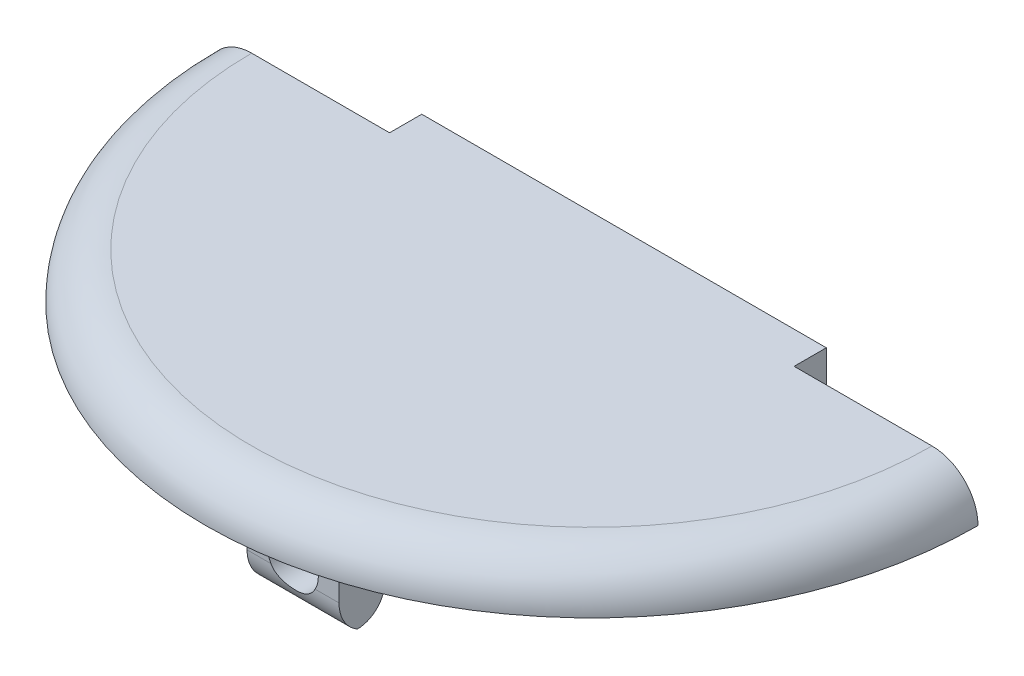
ISO-10303-21;
HEADER;
FILE_DESCRIPTION(('STEP AP214'),'2;1');
FILE_NAME('part.step','',(''),(''),'','','');
FILE_SCHEMA(('AUTOMOTIVE_DESIGN { 1 0 10303 214 1 1 1 1 }'));
ENDSEC;
DATA;
#1=APPLICATION_CONTEXT('core data for automotive mechanical design processes');
#2=APPLICATION_PROTOCOL_DEFINITION('international standard','automotive_design',2000,#1);
#3=PRODUCT_CONTEXT('',#1,'mechanical');
#4=PRODUCT('Part','Part','',(#3));
#5=PRODUCT_RELATED_PRODUCT_CATEGORY('part','',(#4));
#6=PRODUCT_DEFINITION_FORMATION('','',#4);
#7=PRODUCT_DEFINITION_CONTEXT('part definition',#1,'design');
#8=PRODUCT_DEFINITION('design','',#6,#7);
#9=PRODUCT_DEFINITION_SHAPE('','',#8);
#10=(LENGTH_UNIT() NAMED_UNIT(*) SI_UNIT(.MILLI.,.METRE.));
#11=(NAMED_UNIT(*) PLANE_ANGLE_UNIT() SI_UNIT($,.RADIAN.));
#12=(NAMED_UNIT(*) SI_UNIT($,.STERADIAN.) SOLID_ANGLE_UNIT());
#13=UNCERTAINTY_MEASURE_WITH_UNIT(LENGTH_MEASURE(1.E-05),#10,'distance_accuracy_value','');
#14=(GEOMETRIC_REPRESENTATION_CONTEXT(3) GLOBAL_UNCERTAINTY_ASSIGNED_CONTEXT((#13)) GLOBAL_UNIT_ASSIGNED_CONTEXT((#10,
#11,#12)) REPRESENTATION_CONTEXT('',''));
#15=CARTESIAN_POINT('',(0.,0.,0.));
#16=DIRECTION('',(0.,0.,1.));
#17=DIRECTION('',(1.,0.,0.));
#18=AXIS2_PLACEMENT_3D('',#15,#16,#17);
#19=CARTESIAN_POINT('',(0.,55.,0.));
#20=DIRECTION('',(0.,1.,0.));
#21=DIRECTION('',(0.,0.,1.));
#22=AXIS2_PLACEMENT_3D('',#19,#20,#21);
#23=PLANE('',#22);
#24=DIRECTION('',(0.,0.,-1.));
#25=VECTOR('',#24,1.);
#26=CARTESIAN_POINT('',(-22.,55.,0.));
#27=LINE('',#26,#25);
#28=CARTESIAN_POINT('',(-22.,55.,0.));
#29=VERTEX_POINT('',#28);
#30=CARTESIAN_POINT('',(-22.,55.,-3.5));
#31=VERTEX_POINT('',#30);
#32=EDGE_CURVE('E155',#29,#31,#27,.T.);
#33=ORIENTED_EDGE('',*,*,#32,.T.);
#34=DIRECTION('',(1.,0.,0.));
#35=VECTOR('',#34,1.);
#36=CARTESIAN_POINT('',(-22.,55.,-3.5));
#37=LINE('',#36,#35);
#38=CARTESIAN_POINT('',(22.,55.,-3.5));
#39=VERTEX_POINT('',#38);
#40=EDGE_CURVE('E138',#31,#39,#37,.T.);
#41=ORIENTED_EDGE('',*,*,#40,.T.);
#42=DIRECTION('',(0.,0.,1.));
#43=VECTOR('',#42,1.);
#44=CARTESIAN_POINT('',(22.,55.,0.));
#45=LINE('',#44,#43);
#46=CARTESIAN_POINT('',(22.,55.,0.));
#47=VERTEX_POINT('',#46);
#48=EDGE_CURVE('E167',#39,#47,#45,.T.);
#49=ORIENTED_EDGE('',*,*,#48,.T.);
#50=DIRECTION('',(1.,0.,0.));
#51=VECTOR('',#50,1.);
#52=CARTESIAN_POINT('',(0.,55.,0.));
#53=LINE('',#52,#51);
#54=CARTESIAN_POINT('',(42.,55.,0.));
#55=VERTEX_POINT('',#54);
#56=EDGE_CURVE('E174',#47,#55,#53,.T.);
#57=ORIENTED_EDGE('',*,*,#56,.T.);
#58=CARTESIAN_POINT('',(0.,55.,0.));
#59=DIRECTION('',(0.,-1.,0.));
#60=DIRECTION('',(0.,0.,-1.));
#61=AXIS2_PLACEMENT_3D('',#58,#59,#60);
#62=CIRCLE('',#61,42.);
#63=CARTESIAN_POINT('',(-42.,55.,0.));
#64=VERTEX_POINT('',#63);
#65=EDGE_CURVE('E223',#55,#64,#62,.T.);
#66=ORIENTED_EDGE('',*,*,#65,.T.);
#67=DIRECTION('',(1.,0.,0.));
#68=VECTOR('',#67,1.);
#69=CARTESIAN_POINT('',(0.,55.,0.));
#70=LINE('',#69,#68);
#71=EDGE_CURVE('E164',#64,#29,#70,.T.);
#72=ORIENTED_EDGE('',*,*,#71,.T.);
#73=EDGE_LOOP('',(#33,#41,#49,#57,#66,#72));
#74=FACE_BOUND('',#73,.T.);
#75=DIRECTION('',(0.,0.,1.));
#76=VECTOR('',#75,1.);
#77=CARTESIAN_POINT('',(4.99999999999999,55.,32.5));
#78=LINE('',#77,#76);
#79=CARTESIAN_POINT('',(4.99999999999999,55.,27.5));
#80=VERTEX_POINT('',#79);
#81=CARTESIAN_POINT('',(4.99999999999999,55.,32.5));
#82=VERTEX_POINT('',#81);
#83=EDGE_CURVE('E185',#80,#82,#78,.T.);
#84=ORIENTED_EDGE('',*,*,#83,.F.);
#85=DIRECTION('',(1.,0.,0.));
#86=VECTOR('',#85,1.);
#87=CARTESIAN_POINT('',(-5.00000000000001,55.,27.5));
#88=LINE('',#87,#86);
#89=CARTESIAN_POINT('',(-5.00000000000001,55.,27.5));
#90=VERTEX_POINT('',#89);
#91=EDGE_CURVE('E197',#90,#80,#88,.T.);
#92=ORIENTED_EDGE('',*,*,#91,.F.);
#93=DIRECTION('',(0.,0.,-1.));
#94=VECTOR('',#93,1.);
#95=CARTESIAN_POINT('',(-5.00000000000001,55.,32.5));
#96=LINE('',#95,#94);
#97=CARTESIAN_POINT('',(-5.00000000000001,55.,32.5));
#98=VERTEX_POINT('',#97);
#99=EDGE_CURVE('E193',#98,#90,#96,.T.);
#100=ORIENTED_EDGE('',*,*,#99,.F.);
#101=DIRECTION('',(-1.,0.,0.));
#102=VECTOR('',#101,1.);
#103=CARTESIAN_POINT('',(-5.00000000000001,55.,32.5));
#104=LINE('',#103,#102);
#105=EDGE_CURVE('E189',#82,#98,#104,.T.);
#106=ORIENTED_EDGE('',*,*,#105,.F.);
#107=EDGE_LOOP('',(#84,#92,#100,#106));
#108=FACE_BOUND('',#107,.T.);
#109=ADVANCED_FACE('F42',(#74,#108),#23,.F.);
#110=CARTESIAN_POINT('',(37.,60.,0.));
#111=DIRECTION('',(0.,1.,0.));
#112=DIRECTION('',(0.,0.,1.));
#113=AXIS2_PLACEMENT_3D('',#110,#111,#112);
#114=PLANE('',#113);
#115=DIRECTION('',(1.,0.,0.));
#116=VECTOR('',#115,1.);
#117=CARTESIAN_POINT('',(-22.,60.,-3.5));
#118=LINE('',#117,#116);
#119=CARTESIAN_POINT('',(-22.,60.,-3.5));
#120=VERTEX_POINT('',#119);
#121=CARTESIAN_POINT('',(22.,60.,-3.5));
#122=VERTEX_POINT('',#121);
#123=EDGE_CURVE('E150',#120,#122,#118,.T.);
#124=ORIENTED_EDGE('',*,*,#123,.F.);
#125=DIRECTION('',(0.,0.,-1.));
#126=VECTOR('',#125,1.);
#127=CARTESIAN_POINT('',(-22.,60.,-7.));
#128=LINE('',#127,#126);
#129=CARTESIAN_POINT('',(-22.,60.,0.));
#130=VERTEX_POINT('',#129);
#131=EDGE_CURVE('E158',#130,#120,#128,.T.);
#132=ORIENTED_EDGE('',*,*,#131,.F.);
#133=DIRECTION('',(1.,0.,0.));
#134=VECTOR('',#133,1.);
#135=CARTESIAN_POINT('',(-42.,60.,0.));
#136=LINE('',#135,#134);
#137=CARTESIAN_POINT('',(-37.,60.,0.));
#138=VERTEX_POINT('',#137);
#139=EDGE_CURVE('E314',#138,#130,#136,.T.);
#140=ORIENTED_EDGE('',*,*,#139,.F.);
#141=CARTESIAN_POINT('',(0.,60.,0.));
#142=DIRECTION('',(0.,-1.,0.));
#143=DIRECTION('',(0.,0.,-1.));
#144=AXIS2_PLACEMENT_3D('',#141,#142,#143);
#145=CIRCLE('',#144,37.);
#146=CARTESIAN_POINT('',(37.,60.,0.));
#147=VERTEX_POINT('',#146);
#148=EDGE_CURVE('E219',#147,#138,#145,.T.);
#149=ORIENTED_EDGE('',*,*,#148,.F.);
#150=DIRECTION('',(1.,0.,0.));
#151=VECTOR('',#150,1.);
#152=CARTESIAN_POINT('',(42.,60.,0.));
#153=LINE('',#152,#151);
#154=CARTESIAN_POINT('',(22.,60.,0.));
#155=VERTEX_POINT('',#154);
#156=EDGE_CURVE('E325',#155,#147,#153,.T.);
#157=ORIENTED_EDGE('',*,*,#156,.F.);
#158=DIRECTION('',(0.,0.,1.));
#159=VECTOR('',#158,1.);
#160=CARTESIAN_POINT('',(22.,60.,-7.));
#161=LINE('',#160,#159);
#162=EDGE_CURVE('E313',#122,#155,#161,.T.);
#163=ORIENTED_EDGE('',*,*,#162,.F.);
#164=EDGE_LOOP('',(#124,#132,#140,#149,#157,#163));
#165=FACE_BOUND('',#164,.T.);
#166=ADVANCED_FACE('F347',(#165),#114,.T.);
#167=CARTESIAN_POINT('',(0.,55.,0.));
#168=DIRECTION('',(0.,-1.,0.));
#169=DIRECTION('',(0.,0.,-1.));
#170=AXIS2_PLACEMENT_3D('',#167,#168,#169);
#171=TOROIDAL_SURFACE('',#170,37.,5.);
#172=CARTESIAN_POINT('',(-37.,55.,0.));
#173=DIRECTION('',(0.,0.,1.));
#174=DIRECTION('',(1.,0.,0.));
#175=AXIS2_PLACEMENT_3D('',#172,#173,#174);
#176=CIRCLE('',#175,5.);
#177=EDGE_CURVE('E216',#64,#138,#176,.F.);
#178=ORIENTED_EDGE('',*,*,#177,.F.);
#179=ORIENTED_EDGE('',*,*,#65,.F.);
#180=CARTESIAN_POINT('',(37.,55.,0.));
#181=DIRECTION('',(0.,0.,1.));
#182=DIRECTION('',(1.,0.,0.));
#183=AXIS2_PLACEMENT_3D('',#180,#181,#182);
#184=CIRCLE('',#183,5.);
#185=EDGE_CURVE('E213',#147,#55,#184,.F.);
#186=ORIENTED_EDGE('',*,*,#185,.F.);
#187=ORIENTED_EDGE('',*,*,#148,.T.);
#188=EDGE_LOOP('',(#178,#179,#186,#187));
#189=FACE_BOUND('',#188,.T.);
#190=ADVANCED_FACE('F341',(#189),#171,.T.);
#191=CARTESIAN_POINT('',(4.99999999999999,42.,32.5));
#192=DIRECTION('',(-1.,0.,0.));
#193=DIRECTION('',(0.,0.,1.));
#194=AXIS2_PLACEMENT_3D('',#191,#192,#193);
#195=PLANE('',#194);
#196=DIRECTION('',(0.,1.,0.));
#197=VECTOR('',#196,1.);
#198=CARTESIAN_POINT('',(4.99999999999999,42.,32.5));
#199=LINE('',#198,#197);
#200=CARTESIAN_POINT('',(4.99999999999999,45.4641016151378,32.5));
#201=VERTEX_POINT('',#200);
#202=EDGE_CURVE('E210',#201,#82,#199,.T.);
#203=ORIENTED_EDGE('',*,*,#202,.F.);
#204=CARTESIAN_POINT('',(4.99999999999999,45.4641016151378,28.5));
#205=DIRECTION('',(-1.,0.,0.));
#206=DIRECTION('',(0.,0.,1.));
#207=AXIS2_PLACEMENT_3D('',#204,#205,#206);
#208=CIRCLE('',#207,4.);
#209=CARTESIAN_POINT('',(4.99999999999999,42.,30.5));
#210=VERTEX_POINT('',#209);
#211=EDGE_CURVE('E12',#201,#210,#208,.F.);
#212=ORIENTED_EDGE('',*,*,#211,.T.);
#213=CARTESIAN_POINT('',(4.99999999999999,45.,30.5));
#214=DIRECTION('',(-1.,0.,0.));
#215=DIRECTION('',(0.,0.,1.));
#216=AXIS2_PLACEMENT_3D('',#213,#214,#215);
#217=CIRCLE('',#216,3.);
#218=CARTESIAN_POINT('',(4.99999999999999,45.,27.5));
#219=VERTEX_POINT('',#218);
#220=EDGE_CURVE('E239',#210,#219,#217,.F.);
#221=ORIENTED_EDGE('',*,*,#220,.T.);
#222=DIRECTION('',(0.,1.,0.));
#223=VECTOR('',#222,1.);
#224=CARTESIAN_POINT('',(4.99999999999999,42.,27.5));
#225=LINE('',#224,#223);
#226=EDGE_CURVE('E201',#219,#80,#225,.T.);
#227=ORIENTED_EDGE('',*,*,#226,.T.);
#228=ORIENTED_EDGE('',*,*,#83,.T.);
#229=EDGE_LOOP('',(#203,#212,#221,#227,#228));
#230=FACE_BOUND('',#229,.T.);
#231=ADVANCED_FACE('F372',(#230),#195,.F.);
#232=CARTESIAN_POINT('',(-5.00000000000001,42.,32.5));
#233=DIRECTION('',(0.,0.,-1.));
#234=DIRECTION('',(-1.,0.,0.));
#235=AXIS2_PLACEMENT_3D('',#232,#233,#234);
#236=PLANE('',#235);
#237=DIRECTION('',(0.,1.,0.));
#238=VECTOR('',#237,1.);
#239=CARTESIAN_POINT('',(-5.00000000000001,42.,32.5));
#240=LINE('',#239,#238);
#241=CARTESIAN_POINT('',(-5.00000000000001,45.4641016151378,32.5));
#242=VERTEX_POINT('',#241);
#243=EDGE_CURVE('E207',#242,#98,#240,.T.);
#244=ORIENTED_EDGE('',*,*,#243,.F.);
#245=DIRECTION('',(1.,0.,0.));
#246=VECTOR('',#245,1.);
#247=CARTESIAN_POINT('',(-5.00000000000001,45.4641016151378,32.5));
#248=LINE('',#247,#246);
#249=CARTESIAN_POINT('',(-2.40372117878146,45.4641016151378,32.5));
#250=VERTEX_POINT('',#249);
#251=EDGE_CURVE('E65',#242,#250,#248,.T.);
#252=ORIENTED_EDGE('',*,*,#251,.T.);
#253=CARTESIAN_POINT('',(0.,46.8,32.5));
#254=DIRECTION('',(0.,0.,-1.));
#255=DIRECTION('',(-1.,0.,0.));
#256=AXIS2_PLACEMENT_3D('',#253,#254,#255);
#257=CIRCLE('',#256,2.75);
#258=CARTESIAN_POINT('',(2.40372117878143,45.4641016151378,32.5));
#259=VERTEX_POINT('',#258);
#260=EDGE_CURVE('E296',#250,#259,#257,.T.);
#261=ORIENTED_EDGE('',*,*,#260,.T.);
#262=DIRECTION('',(1.,0.,0.));
#263=VECTOR('',#262,1.);
#264=CARTESIAN_POINT('',(-5.00000000000001,45.4641016151378,32.5));
#265=LINE('',#264,#263);
#266=EDGE_CURVE('E59',#259,#201,#265,.T.);
#267=ORIENTED_EDGE('',*,*,#266,.T.);
#268=ORIENTED_EDGE('',*,*,#202,.T.);
#269=ORIENTED_EDGE('',*,*,#105,.T.);
#270=EDGE_LOOP('',(#244,#252,#261,#267,#268,#269));
#271=FACE_BOUND('',#270,.T.);
#272=ADVANCED_FACE('F297',(#271),#236,.F.);
#273=CARTESIAN_POINT('',(-5.00000000000001,42.,32.5));
#274=DIRECTION('',(1.,0.,0.));
#275=DIRECTION('',(0.,0.,-1.));
#276=AXIS2_PLACEMENT_3D('',#273,#274,#275);
#277=PLANE('',#276);
#278=CARTESIAN_POINT('',(-5.00000000000001,45.,30.5));
#279=DIRECTION('',(1.,0.,0.));
#280=DIRECTION('',(0.,0.,-1.));
#281=AXIS2_PLACEMENT_3D('',#278,#279,#280);
#282=CIRCLE('',#281,3.);
#283=CARTESIAN_POINT('',(-5.00000000000001,45.,27.5));
#284=VERTEX_POINT('',#283);
#285=CARTESIAN_POINT('',(-5.00000000000001,42.,30.5));
#286=VERTEX_POINT('',#285);
#287=EDGE_CURVE('E256',#284,#286,#282,.F.);
#288=ORIENTED_EDGE('',*,*,#287,.T.);
#289=CARTESIAN_POINT('',(-5.00000000000001,45.4641016151378,28.5));
#290=DIRECTION('',(1.,0.,0.));
#291=DIRECTION('',(0.,0.,-1.));
#292=AXIS2_PLACEMENT_3D('',#289,#290,#291);
#293=CIRCLE('',#292,4.);
#294=EDGE_CURVE('E278',#286,#242,#293,.F.);
#295=ORIENTED_EDGE('',*,*,#294,.T.);
#296=ORIENTED_EDGE('',*,*,#243,.T.);
#297=ORIENTED_EDGE('',*,*,#99,.T.);
#298=DIRECTION('',(0.,1.,0.));
#299=VECTOR('',#298,1.);
#300=CARTESIAN_POINT('',(-5.00000000000001,42.,27.5));
#301=LINE('',#300,#299);
#302=EDGE_CURVE('E204',#284,#90,#301,.T.);
#303=ORIENTED_EDGE('',*,*,#302,.F.);
#304=EDGE_LOOP('',(#288,#295,#296,#297,#303));
#305=FACE_BOUND('',#304,.T.);
#306=ADVANCED_FACE('F286',(#305),#277,.F.);
#307=CARTESIAN_POINT('',(-5.00000000000001,42.,27.5));
#308=DIRECTION('',(0.,0.,1.));
#309=DIRECTION('',(1.,0.,0.));
#310=AXIS2_PLACEMENT_3D('',#307,#308,#309);
#311=PLANE('',#310);
#312=ORIENTED_EDGE('',*,*,#226,.F.);
#313=DIRECTION('',(1.,0.,0.));
#314=VECTOR('',#313,1.);
#315=CARTESIAN_POINT('',(-5.00000000000001,45.,27.5));
#316=LINE('',#315,#314);
#317=CARTESIAN_POINT('',(2.07906228862917,45.,27.5));
#318=VERTEX_POINT('',#317);
#319=EDGE_CURVE('E245',#219,#318,#316,.F.);
#320=ORIENTED_EDGE('',*,*,#319,.T.);
#321=CARTESIAN_POINT('',(0.,46.8,27.5));
#322=DIRECTION('',(0.,0.,-1.));
#323=DIRECTION('',(-1.,0.,0.));
#324=AXIS2_PLACEMENT_3D('',#321,#322,#323);
#325=CIRCLE('',#324,2.75);
#326=CARTESIAN_POINT('',(-2.07906228862919,45.,27.5));
#327=VERTEX_POINT('',#326);
#328=EDGE_CURVE('E299',#327,#318,#325,.T.);
#329=ORIENTED_EDGE('',*,*,#328,.F.);
#330=DIRECTION('',(1.,0.,0.));
#331=VECTOR('',#330,1.);
#332=CARTESIAN_POINT('',(-5.00000000000001,45.,27.5));
#333=LINE('',#332,#331);
#334=EDGE_CURVE('E242',#327,#284,#333,.F.);
#335=ORIENTED_EDGE('',*,*,#334,.T.);
#336=ORIENTED_EDGE('',*,*,#302,.T.);
#337=ORIENTED_EDGE('',*,*,#91,.T.);
#338=EDGE_LOOP('',(#312,#320,#329,#335,#336,#337));
#339=FACE_BOUND('',#338,.T.);
#340=ADVANCED_FACE('F385',(#339),#311,.F.);
#341=CARTESIAN_POINT('',(-22.,53.,-7.));
#342=DIRECTION('',(1.,0.,0.));
#343=DIRECTION('',(0.,0.,-1.));
#344=AXIS2_PLACEMENT_3D('',#341,#342,#343);
#345=PLANE('',#344);
#346=ORIENTED_EDGE('',*,*,#131,.T.);
#347=DIRECTION('',(0.,1.,0.));
#348=VECTOR('',#347,1.);
#349=CARTESIAN_POINT('',(-22.,55.,-3.5));
#350=LINE('',#349,#348);
#351=EDGE_CURVE('E142',#31,#120,#350,.T.);
#352=ORIENTED_EDGE('',*,*,#351,.F.);
#353=ORIENTED_EDGE('',*,*,#32,.F.);
#354=DIRECTION('',(0.,1.,0.));
#355=VECTOR('',#354,1.);
#356=CARTESIAN_POINT('',(-22.,53.,0.));
#357=LINE('',#356,#355);
#358=EDGE_CURVE('E231',#29,#130,#357,.T.);
#359=ORIENTED_EDGE('',*,*,#358,.T.);
#360=EDGE_LOOP('',(#346,#352,#353,#359));
#361=FACE_BOUND('',#360,.T.);
#362=ADVANCED_FACE('F154',(#361),#345,.F.);
#363=CARTESIAN_POINT('',(-42.,53.,0.));
#364=DIRECTION('',(0.,0.,1.));
#365=DIRECTION('',(1.,0.,0.));
#366=AXIS2_PLACEMENT_3D('',#363,#364,#365);
#367=PLANE('',#366);
#368=CARTESIAN_POINT('',(-29.45,57.5,0.));
#369=DIRECTION('',(0.,0.,1.));
#370=DIRECTION('',(1.,0.,0.));
#371=AXIS2_PLACEMENT_3D('',#368,#369,#370);
#372=CIRCLE('',#371,1.5);
#373=CARTESIAN_POINT('',(-27.95,57.5,0.));
#374=VERTEX_POINT('',#373);
#375=EDGE_CURVE('E227',#374,#374,#372,.F.);
#376=ORIENTED_EDGE('',*,*,#375,.F.);
#377=EDGE_LOOP('',(#376));
#378=FACE_BOUND('',#377,.T.);
#379=ORIENTED_EDGE('',*,*,#177,.T.);
#380=ORIENTED_EDGE('',*,*,#139,.T.);
#381=ORIENTED_EDGE('',*,*,#358,.F.);
#382=ORIENTED_EDGE('',*,*,#71,.F.);
#383=EDGE_LOOP('',(#379,#380,#381,#382));
#384=FACE_BOUND('',#383,.T.);
#385=ADVANCED_FACE('F345',(#378,#384),#367,.F.);
#386=CARTESIAN_POINT('',(22.,53.,-7.));
#387=DIRECTION('',(-1.,0.,0.));
#388=DIRECTION('',(0.,0.,1.));
#389=AXIS2_PLACEMENT_3D('',#386,#387,#388);
#390=PLANE('',#389);
#391=ORIENTED_EDGE('',*,*,#48,.F.);
#392=DIRECTION('',(0.,1.,0.));
#393=VECTOR('',#392,1.);
#394=CARTESIAN_POINT('',(22.,55.,-3.5));
#395=LINE('',#394,#393);
#396=EDGE_CURVE('E145',#39,#122,#395,.T.);
#397=ORIENTED_EDGE('',*,*,#396,.T.);
#398=ORIENTED_EDGE('',*,*,#162,.T.);
#399=DIRECTION('',(0.,1.,0.));
#400=VECTOR('',#399,1.);
#401=CARTESIAN_POINT('',(22.,53.,0.));
#402=LINE('',#401,#400);
#403=EDGE_CURVE('E318',#47,#155,#402,.T.);
#404=ORIENTED_EDGE('',*,*,#403,.F.);
#405=EDGE_LOOP('',(#391,#397,#398,#404));
#406=FACE_BOUND('',#405,.T.);
#407=ADVANCED_FACE('F351',(#406),#390,.F.);
#408=CARTESIAN_POINT('',(42.,53.,0.));
#409=DIRECTION('',(0.,0.,1.));
#410=DIRECTION('',(1.,0.,0.));
#411=AXIS2_PLACEMENT_3D('',#408,#409,#410);
#412=PLANE('',#411);
#413=CARTESIAN_POINT('',(29.45,57.5,0.));
#414=DIRECTION('',(0.,0.,1.));
#415=DIRECTION('',(1.,0.,0.));
#416=AXIS2_PLACEMENT_3D('',#413,#414,#415);
#417=CIRCLE('',#416,1.5);
#418=CARTESIAN_POINT('',(30.95,57.5,0.));
#419=VERTEX_POINT('',#418);
#420=EDGE_CURVE('E232',#419,#419,#417,.F.);
#421=ORIENTED_EDGE('',*,*,#420,.F.);
#422=EDGE_LOOP('',(#421));
#423=FACE_BOUND('',#422,.T.);
#424=ORIENTED_EDGE('',*,*,#403,.T.);
#425=ORIENTED_EDGE('',*,*,#156,.T.);
#426=ORIENTED_EDGE('',*,*,#185,.T.);
#427=ORIENTED_EDGE('',*,*,#56,.F.);
#428=EDGE_LOOP('',(#424,#425,#426,#427));
#429=FACE_BOUND('',#428,.T.);
#430=ADVANCED_FACE('F352',(#423,#429),#412,.F.);
#431=CARTESIAN_POINT('',(-29.45,57.5,13.));
#432=DIRECTION('',(0.,0.,-1.));
#433=DIRECTION('',(-1.,0.,0.));
#434=AXIS2_PLACEMENT_3D('',#431,#432,#433);
#435=PLANE('',#434);
#436=CARTESIAN_POINT('',(-29.45,57.5,13.));
#437=DIRECTION('',(0.,0.,-1.));
#438=DIRECTION('',(-1.,0.,0.));
#439=AXIS2_PLACEMENT_3D('',#436,#437,#438);
#440=CIRCLE('',#439,1.5);
#441=CARTESIAN_POINT('',(-30.95,57.5,13.));
#442=VERTEX_POINT('',#441);
#443=EDGE_CURVE('E166',#442,#442,#440,.T.);
#444=ORIENTED_EDGE('',*,*,#443,.T.);
#445=EDGE_LOOP('',(#444));
#446=FACE_BOUND('',#445,.T.);
#447=ADVANCED_FACE('F354',(#446),#435,.T.);
#448=CARTESIAN_POINT('',(-29.45,57.5,13.));
#449=DIRECTION('',(0.,0.,-1.));
#450=DIRECTION('',(-1.,0.,0.));
#451=AXIS2_PLACEMENT_3D('',#448,#449,#450);
#452=CYLINDRICAL_SURFACE('',#451,1.5);
#453=ORIENTED_EDGE('',*,*,#375,.T.);
#454=EDGE_LOOP('',(#453));
#455=FACE_BOUND('',#454,.T.);
#456=ORIENTED_EDGE('',*,*,#443,.F.);
#457=EDGE_LOOP('',(#456));
#458=FACE_BOUND('',#457,.T.);
#459=ADVANCED_FACE('F361',(#455,#458),#452,.F.);
#460=CARTESIAN_POINT('',(29.45,57.5,13.));
#461=DIRECTION('',(0.,0.,-1.));
#462=DIRECTION('',(-1.,0.,0.));
#463=AXIS2_PLACEMENT_3D('',#460,#461,#462);
#464=PLANE('',#463);
#465=CARTESIAN_POINT('',(29.45,57.5,13.));
#466=DIRECTION('',(0.,0.,-1.));
#467=DIRECTION('',(-1.,0.,0.));
#468=AXIS2_PLACEMENT_3D('',#465,#466,#467);
#469=CIRCLE('',#468,1.5);
#470=CARTESIAN_POINT('',(27.95,57.5,13.));
#471=VERTEX_POINT('',#470);
#472=EDGE_CURVE('E172',#471,#471,#469,.T.);
#473=ORIENTED_EDGE('',*,*,#472,.T.);
#474=EDGE_LOOP('',(#473));
#475=FACE_BOUND('',#474,.T.);
#476=ADVANCED_FACE('F397',(#475),#464,.T.);
#477=CARTESIAN_POINT('',(29.45,57.5,13.));
#478=DIRECTION('',(0.,0.,-1.));
#479=DIRECTION('',(-1.,0.,0.));
#480=AXIS2_PLACEMENT_3D('',#477,#478,#479);
#481=CYLINDRICAL_SURFACE('',#480,1.5);
#482=ORIENTED_EDGE('',*,*,#420,.T.);
#483=EDGE_LOOP('',(#482));
#484=FACE_BOUND('',#483,.T.);
#485=ORIENTED_EDGE('',*,*,#472,.F.);
#486=EDGE_LOOP('',(#485));
#487=FACE_BOUND('',#486,.T.);
#488=ADVANCED_FACE('F400',(#484,#487),#481,.F.);
#489=CARTESIAN_POINT('',(-22.,55.,-3.5));
#490=DIRECTION('',(0.,0.,1.));
#491=DIRECTION('',(1.,0.,0.));
#492=AXIS2_PLACEMENT_3D('',#489,#490,#491);
#493=PLANE('',#492);
#494=ORIENTED_EDGE('',*,*,#123,.T.);
#495=ORIENTED_EDGE('',*,*,#396,.F.);
#496=ORIENTED_EDGE('',*,*,#40,.F.);
#497=ORIENTED_EDGE('',*,*,#351,.T.);
#498=EDGE_LOOP('',(#494,#495,#496,#497));
#499=FACE_BOUND('',#498,.T.);
#500=CARTESIAN_POINT('',(0.,57.5,-3.5));
#501=DIRECTION('',(0.,0.,1.));
#502=DIRECTION('',(1.,0.,0.));
#503=AXIS2_PLACEMENT_3D('',#500,#501,#502);
#504=CIRCLE('',#503,1.5);
#505=CARTESIAN_POINT('',(1.5,57.5,-3.5));
#506=VERTEX_POINT('',#505);
#507=EDGE_CURVE('E308',#506,#506,#504,.F.);
#508=ORIENTED_EDGE('',*,*,#507,.F.);
#509=EDGE_LOOP('',(#508));
#510=FACE_BOUND('',#509,.T.);
#511=ADVANCED_FACE('F140',(#499,#510),#493,.F.);
#512=CARTESIAN_POINT('',(0.,57.5,13.));
#513=DIRECTION('',(0.,0.,-1.));
#514=DIRECTION('',(-1.,0.,0.));
#515=AXIS2_PLACEMENT_3D('',#512,#513,#514);
#516=PLANE('',#515);
#517=CARTESIAN_POINT('',(0.,57.5,13.));
#518=DIRECTION('',(0.,0.,-1.));
#519=DIRECTION('',(-1.,0.,0.));
#520=AXIS2_PLACEMENT_3D('',#517,#518,#519);
#521=CIRCLE('',#520,1.5);
#522=CARTESIAN_POINT('',(-1.5,57.5,13.));
#523=VERTEX_POINT('',#522);
#524=EDGE_CURVE('E180',#523,#523,#521,.T.);
#525=ORIENTED_EDGE('',*,*,#524,.T.);
#526=EDGE_LOOP('',(#525));
#527=FACE_BOUND('',#526,.T.);
#528=ADVANCED_FACE('F391',(#527),#516,.T.);
#529=CARTESIAN_POINT('',(0.,57.5,13.));
#530=DIRECTION('',(0.,0.,-1.));
#531=DIRECTION('',(-1.,0.,0.));
#532=AXIS2_PLACEMENT_3D('',#529,#530,#531);
#533=CYLINDRICAL_SURFACE('',#532,1.5);
#534=ORIENTED_EDGE('',*,*,#507,.T.);
#535=EDGE_LOOP('',(#534));
#536=FACE_BOUND('',#535,.T.);
#537=ORIENTED_EDGE('',*,*,#524,.F.);
#538=EDGE_LOOP('',(#537));
#539=FACE_BOUND('',#538,.T.);
#540=ADVANCED_FACE('F265',(#536,#539),#533,.F.);
#541=CARTESIAN_POINT('',(0.,46.8,32.5));
#542=DIRECTION('',(0.,0.,-1.));
#543=DIRECTION('',(-1.,0.,0.));
#544=AXIS2_PLACEMENT_3D('',#541,#542,#543);
#545=CYLINDRICAL_SURFACE('',#544,2.75);
#546=ORIENTED_EDGE('',*,*,#260,.F.);
#547=CARTESIAN_POINT('',(-2.40372117878146,45.4641016151378,32.5));
#548=CARTESIAN_POINT('',(-2.36711302847921,45.398209137616,32.5000078743555));
#549=CARTESIAN_POINT('',(-2.32778991505423,45.3338553849881,32.4983721299485));
#550=CARTESIAN_POINT('',(-2.24409636912401,45.2087182740776,32.492328081148));
#551=CARTESIAN_POINT('',(-2.19972957631146,45.1479323885316,32.4879217658196));
#552=CARTESIAN_POINT('',(-2.10642490030498,45.03051333628,32.4768672259823));
#553=CARTESIAN_POINT('',(-2.0575018513271,44.9738676955037,32.4702261048938));
#554=CARTESIAN_POINT('',(-1.95533959291393,44.8648687474732,32.4552431001918));
#555=CARTESIAN_POINT('',(-1.90209965763306,44.812516165047,32.4469009302036));
#556=CARTESIAN_POINT('',(-1.73668313813339,44.6625931626014,32.4201866692838));
#557=CARTESIAN_POINT('',(-1.61851921716736,44.5717933118049,32.4000861838755));
#558=CARTESIAN_POINT('',(-1.36910446025443,44.4104036562703,32.3596212653033));
#559=CARTESIAN_POINT('',(-1.23784195160646,44.3398320985979,32.3392566110413));
#560=CARTESIAN_POINT('',(-0.958555426572806,44.2177590727081,32.3014376911243));
#561=CARTESIAN_POINT('',(-0.8100288951983,44.1673380052591,32.2841705036123));
#562=CARTESIAN_POINT('',(-0.505941674145723,44.0924165416468,32.2576715505479));
#563=CARTESIAN_POINT('',(-0.350386203648273,44.0678972321005,32.2484339227104));
#564=CARTESIAN_POINT('',(-0.0442496702940312,44.0462743358827,32.2403060544321));
#565=CARTESIAN_POINT('',(0.106234893455529,44.0479719149814,32.2409633091687));
#566=CARTESIAN_POINT('',(0.404591163576067,44.0758015795133,32.2513777039357));
#567=CARTESIAN_POINT('',(0.552462809046757,44.1019342337008,32.2611350557814));
#568=CARTESIAN_POINT('',(0.837364432845036,44.176562592806,32.287312387793));
#569=CARTESIAN_POINT('',(0.974581023309118,44.2244209499888,32.3035409798873));
#570=CARTESIAN_POINT('',(1.23948882406196,44.340909772792,32.3395495917137));
#571=CARTESIAN_POINT('',(1.36717223722685,44.4095570144554,32.3593324743943));
#572=CARTESIAN_POINT('',(1.61783318848274,44.5709380244152,32.3999495843655));
#573=CARTESIAN_POINT('',(1.74001595090649,44.6649104678546,32.4207721133605));
#574=CARTESIAN_POINT('',(1.96724334887179,44.8723036907194,32.4573716810483));
#575=CARTESIAN_POINT('',(2.0723212824674,44.9856857801804,32.4731585815633));
#576=CARTESIAN_POINT('',(2.2111906909166,45.1634658014858,32.4890870589198));
#577=CARTESIAN_POINT('',(2.25294342178273,45.2214402208739,32.493077141097));
#578=CARTESIAN_POINT('',(2.33184206248145,45.34051072317,32.4985346667327));
#579=CARTESIAN_POINT('',(2.36899028716368,45.4016052155126,32.5000033825836));
#580=CARTESIAN_POINT('',(2.40372117878144,45.4641016151378,32.5));
#581=B_SPLINE_CURVE_WITH_KNOTS('',3,(#547,#548,#549,#550,#551,#552,#553,#554,#555,#556,#557,
#558,#559,#560,#561,#562,#563,#564,#565,#566,#567,#568,#569,#570,#571,#572,#573,#574,#575,#576,
#577,#578,#579,#580),.UNSPECIFIED.,.F.,.F.,(4,2,2,2,2,2,2,2,2,2,2,2,2,2,2,2,4),(0.,
0.226015552168935,0.451869026860376,0.677011293504946,0.902191494610036,1.35116585743355,
1.80054395508555,2.27153460903568,2.74218110884879,3.19137245084237,3.64057424853771,
4.07737391168319,4.51452700336839,4.97904222843647,5.44264207619921,5.65708433470513,
5.87141834435961),.UNSPECIFIED.);
#582=EDGE_CURVE('E52',#250,#259,#581,.T.);
#583=ORIENTED_EDGE('',*,*,#582,.T.);
#584=EDGE_LOOP('',(#546,#583));
#585=FACE_BOUND('',#584,.T.);
#586=ORIENTED_EDGE('',*,*,#328,.T.);
#587=CARTESIAN_POINT('',(2.07906228862917,45.,27.5));
#588=CARTESIAN_POINT('',(2.02915988140211,44.9423561532153,27.5000003561285));
#589=CARTESIAN_POINT('',(1.97689655847853,44.886841080234,27.5016610033238));
#590=CARTESIAN_POINT('',(1.86805993937806,44.7804360037604,27.507571477642));
#591=CARTESIAN_POINT('',(1.81148979337561,44.7295426783732,27.5118194279343));
#592=CARTESIAN_POINT('',(1.63603302486799,44.5843993578848,27.5273344647358));
#593=CARTESIAN_POINT('',(1.51121772649249,44.497476200212,27.5413780017026));
#594=CARTESIAN_POINT('',(1.2494862950839,44.3455801129558,27.5712217884897));
#595=CARTESIAN_POINT('',(1.11259149904294,44.280569419556,27.5870189529902));
#596=CARTESIAN_POINT('',(0.829685245925276,44.1737954342199,27.6154805520698));
#597=CARTESIAN_POINT('',(0.683675715222072,44.1320272484212,27.6281456458147));
#598=CARTESIAN_POINT('',(0.383336271717154,44.0724659163265,27.6468079082809));
#599=CARTESIAN_POINT('',(0.228898526835055,44.0551672094115,27.6526671472574));
#600=CARTESIAN_POINT('',(-0.080733447663205,44.0468288694377,27.6554455460875));
#601=CARTESIAN_POINT('',(-0.235927431335034,44.0557812027506,27.6523674410468));
#602=CARTESIAN_POINT('',(-0.534784963541208,44.0984814249976,27.6385820378744));
#603=CARTESIAN_POINT('',(-0.678643518345523,44.1310118193354,27.6282500969445));
#604=CARTESIAN_POINT('',(-0.959124202950376,44.2184913544616,27.6032266777786));
#605=CARTESIAN_POINT('',(-1.09573782504432,44.2734662206913,27.5885302022798));
#606=CARTESIAN_POINT('',(-1.3636352743854,44.4070297577991,27.5583581329861));
#607=CARTESIAN_POINT('',(-1.49449432520287,44.4864667109974,27.54287472026));
#608=CARTESIAN_POINT('',(-1.74135529418179,44.6661432810527,27.517265809746));
#609=CARTESIAN_POINT('',(-1.85739972968376,44.7663210990696,27.5071247053107));
#610=CARTESIAN_POINT('',(-1.98404849108263,44.8955693229574,27.5017498991939));
#611=CARTESIAN_POINT('',(-2.00350522526533,44.9160498241402,27.5011026716543));
#612=CARTESIAN_POINT('',(-2.04176906104036,44.9575905644062,27.5002280383166));
#613=CARTESIAN_POINT('',(-2.06057661596923,44.9786503796858,27.5000003334879));
#614=CARTESIAN_POINT('',(-2.07906228862919,45.,27.5));
#615=B_SPLINE_CURVE_WITH_KNOTS('',3,(#587,#588,#589,#590,#591,#592,#593,#594,#595,#596,#597,
#598,#599,#600,#601,#602,#603,#604,#605,#606,#607,#608,#609,#610,#611,#612,#613,#614),
.UNSPECIFIED.,.F.,.F.,(4,2,2,2,2,2,2,2,2,2,2,2,2,4),(0.,0.228535790799782,0.456905998779737,
0.912823771118276,1.3679517511855,1.82298386477659,2.28708523541927,2.75104459154927,
3.1926130729606,3.63468909932508,4.09425722230762,4.55247524376067,4.63723645946505,
4.72193723501173),.UNSPECIFIED.);
#616=EDGE_CURVE('E248',#318,#327,#615,.T.);
#617=ORIENTED_EDGE('',*,*,#616,.T.);
#618=EDGE_LOOP('',(#586,#617));
#619=FACE_BOUND('',#618,.T.);
#620=ADVANCED_FACE('F261',(#585,#619),#545,.F.);
#621=CARTESIAN_POINT('',(0.,45.,30.5));
#622=DIRECTION('',(-1.,0.,0.));
#623=DIRECTION('',(0.,0.,1.));
#624=AXIS2_PLACEMENT_3D('',#621,#622,#623);
#625=CYLINDRICAL_SURFACE('',#624,3.);
#626=ORIENTED_EDGE('',*,*,#616,.F.);
#627=ORIENTED_EDGE('',*,*,#319,.F.);
#628=ORIENTED_EDGE('',*,*,#220,.F.);
#629=DIRECTION('',(1.,0.,0.));
#630=VECTOR('',#629,1.);
#631=CARTESIAN_POINT('',(4.99999999999999,42.,30.5));
#632=LINE('',#631,#630);
#633=EDGE_CURVE('E226',#286,#210,#632,.T.);
#634=ORIENTED_EDGE('',*,*,#633,.F.);
#635=ORIENTED_EDGE('',*,*,#287,.F.);
#636=ORIENTED_EDGE('',*,*,#334,.F.);
#637=EDGE_LOOP('',(#626,#627,#628,#634,#635,#636));
#638=FACE_BOUND('',#637,.T.);
#639=ADVANCED_FACE('F258',(#638),#625,.T.);
#640=CARTESIAN_POINT('',(0.,45.4641016151378,28.5));
#641=DIRECTION('',(1.,0.,0.));
#642=DIRECTION('',(0.,0.,-1.));
#643=AXIS2_PLACEMENT_3D('',#640,#641,#642);
#644=CYLINDRICAL_SURFACE('',#643,4.);
#645=ORIENTED_EDGE('',*,*,#582,.F.);
#646=ORIENTED_EDGE('',*,*,#251,.F.);
#647=ORIENTED_EDGE('',*,*,#294,.F.);
#648=ORIENTED_EDGE('',*,*,#633,.T.);
#649=ORIENTED_EDGE('',*,*,#211,.F.);
#650=ORIENTED_EDGE('',*,*,#266,.F.);
#651=EDGE_LOOP('',(#645,#646,#647,#648,#649,#650));
#652=FACE_BOUND('',#651,.T.);
#653=ADVANCED_FACE('F44',(#652),#644,.T.);
#654=CLOSED_SHELL('',(#109,#166,#190,#231,#272,#306,#340,#362,#385,#407,#430,#447,#459,#476,
#488,#511,#528,#540,#620,#639,#653));
#655=MANIFOLD_SOLID_BREP('B2',#654);
#656=ADVANCED_BREP_SHAPE_REPRESENTATION('',(#18,#655),#14);
#657=SHAPE_DEFINITION_REPRESENTATION(#9,#656);
ENDSEC;
END-ISO-10303-21;
